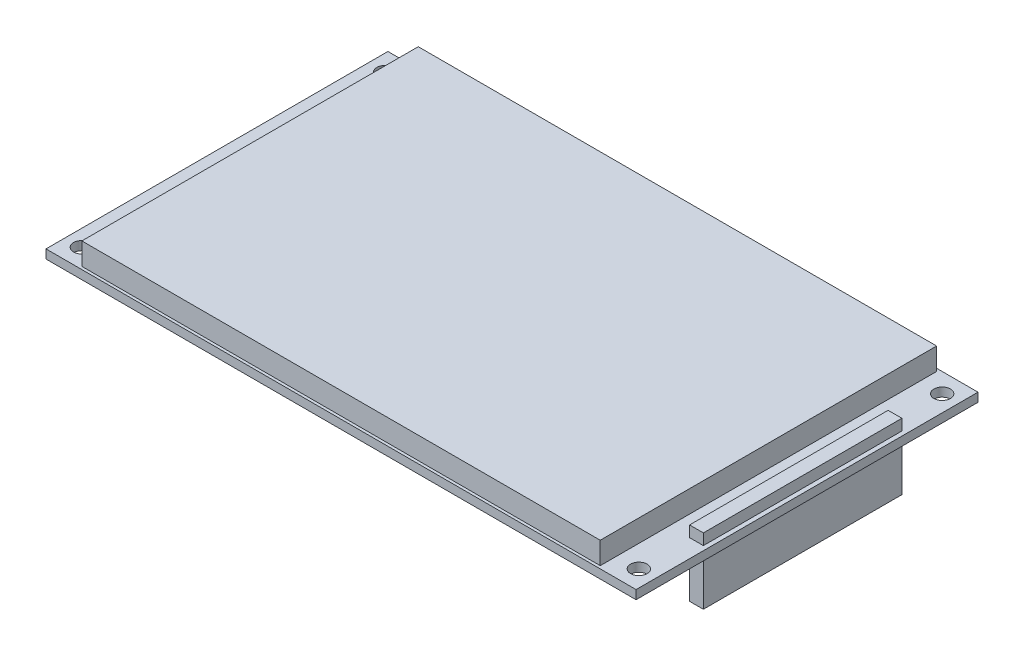
ISO-10303-21;
HEADER;
FILE_DESCRIPTION(('STEP AP214'),'2;1');
FILE_NAME('part.step','',(''),(''),'','','');
FILE_SCHEMA(('AUTOMOTIVE_DESIGN { 1 0 10303 214 1 1 1 1 }'));
ENDSEC;
DATA;
#1=APPLICATION_CONTEXT('core data for automotive mechanical design processes');
#2=APPLICATION_PROTOCOL_DEFINITION('international standard','automotive_design',2000,#1);
#3=PRODUCT_CONTEXT('',#1,'mechanical');
#4=PRODUCT('Part','Part','',(#3));
#5=PRODUCT_RELATED_PRODUCT_CATEGORY('part','',(#4));
#6=PRODUCT_DEFINITION_FORMATION('','',#4);
#7=PRODUCT_DEFINITION_CONTEXT('part definition',#1,'design');
#8=PRODUCT_DEFINITION('design','',#6,#7);
#9=PRODUCT_DEFINITION_SHAPE('','',#8);
#10=(LENGTH_UNIT() NAMED_UNIT(*) SI_UNIT(.MILLI.,.METRE.));
#11=(NAMED_UNIT(*) PLANE_ANGLE_UNIT() SI_UNIT($,.RADIAN.));
#12=(NAMED_UNIT(*) SI_UNIT($,.STERADIAN.) SOLID_ANGLE_UNIT());
#13=UNCERTAINTY_MEASURE_WITH_UNIT(LENGTH_MEASURE(1.E-05),#10,'distance_accuracy_value','');
#14=(GEOMETRIC_REPRESENTATION_CONTEXT(3) GLOBAL_UNCERTAINTY_ASSIGNED_CONTEXT((#13)) GLOBAL_UNIT_ASSIGNED_CONTEXT((#10,
#11,#12)) REPRESENTATION_CONTEXT('',''));
#15=CARTESIAN_POINT('',(0.,0.,0.));
#16=DIRECTION('',(0.,0.,1.));
#17=DIRECTION('',(1.,0.,0.));
#18=AXIS2_PLACEMENT_3D('',#15,#16,#17);
#19=CARTESIAN_POINT('',(-47.,4.,30.5));
#20=DIRECTION('',(1.,0.,0.));
#21=DIRECTION('',(0.,0.,-1.));
#22=AXIS2_PLACEMENT_3D('',#19,#20,#21);
#23=PLANE('',#22);
#24=DIRECTION('',(0.,0.,1.));
#25=VECTOR('',#24,1.);
#26=CARTESIAN_POINT('',(-47.,0.,30.5));
#27=LINE('',#26,#25);
#28=CARTESIAN_POINT('',(-47.,0.,-30.5));
#29=VERTEX_POINT('',#28);
#30=CARTESIAN_POINT('',(-47.,0.,30.5));
#31=VERTEX_POINT('',#30);
#32=EDGE_CURVE('E310',#29,#31,#27,.T.);
#33=ORIENTED_EDGE('',*,*,#32,.T.);
#34=DIRECTION('',(0.,-1.,0.));
#35=VECTOR('',#34,1.);
#36=CARTESIAN_POINT('',(-47.,4.,30.5));
#37=LINE('',#36,#35);
#38=CARTESIAN_POINT('',(-47.,4.,30.5));
#39=VERTEX_POINT('',#38);
#40=EDGE_CURVE('E340',#39,#31,#37,.T.);
#41=ORIENTED_EDGE('',*,*,#40,.F.);
#42=DIRECTION('',(0.,0.,1.));
#43=VECTOR('',#42,1.);
#44=CARTESIAN_POINT('',(-47.,4.,30.5));
#45=LINE('',#44,#43);
#46=CARTESIAN_POINT('',(-47.,4.,-30.5));
#47=VERTEX_POINT('',#46);
#48=EDGE_CURVE('E311',#47,#39,#45,.T.);
#49=ORIENTED_EDGE('',*,*,#48,.F.);
#50=DIRECTION('',(0.,-1.,0.));
#51=VECTOR('',#50,1.);
#52=CARTESIAN_POINT('',(-47.,4.,-30.5));
#53=LINE('',#52,#51);
#54=EDGE_CURVE('E321',#47,#29,#53,.T.);
#55=ORIENTED_EDGE('',*,*,#54,.T.);
#56=EDGE_LOOP('',(#33,#41,#49,#55));
#57=FACE_BOUND('',#56,.T.);
#58=ADVANCED_FACE('F42',(#57),#23,.F.);
#59=CARTESIAN_POINT('',(-47.,4.,30.5));
#60=DIRECTION('',(0.,0.,-1.));
#61=DIRECTION('',(-1.,0.,0.));
#62=AXIS2_PLACEMENT_3D('',#59,#60,#61);
#63=PLANE('',#62);
#64=DIRECTION('',(1.,0.,0.));
#65=VECTOR('',#64,1.);
#66=CARTESIAN_POINT('',(-47.,0.,30.5));
#67=LINE('',#66,#65);
#68=CARTESIAN_POINT('',(47.,0.,30.5));
#69=VERTEX_POINT('',#68);
#70=EDGE_CURVE('E324',#31,#69,#67,.T.);
#71=ORIENTED_EDGE('',*,*,#70,.T.);
#72=DIRECTION('',(0.,-1.,0.));
#73=VECTOR('',#72,1.);
#74=CARTESIAN_POINT('',(47.,4.,30.5));
#75=LINE('',#74,#73);
#76=CARTESIAN_POINT('',(47.,4.,30.5));
#77=VERTEX_POINT('',#76);
#78=EDGE_CURVE('E337',#77,#69,#75,.T.);
#79=ORIENTED_EDGE('',*,*,#78,.F.);
#80=DIRECTION('',(1.,0.,0.));
#81=VECTOR('',#80,1.);
#82=CARTESIAN_POINT('',(-47.,4.,30.5));
#83=LINE('',#82,#81);
#84=EDGE_CURVE('E314',#39,#77,#83,.T.);
#85=ORIENTED_EDGE('',*,*,#84,.F.);
#86=ORIENTED_EDGE('',*,*,#40,.T.);
#87=EDGE_LOOP('',(#71,#79,#85,#86));
#88=FACE_BOUND('',#87,.T.);
#89=ADVANCED_FACE('F380',(#88),#63,.F.);
#90=CARTESIAN_POINT('',(47.,4.,30.5));
#91=DIRECTION('',(-1.,0.,0.));
#92=DIRECTION('',(0.,0.,1.));
#93=AXIS2_PLACEMENT_3D('',#90,#91,#92);
#94=PLANE('',#93);
#95=DIRECTION('',(0.,0.,-1.));
#96=VECTOR('',#95,1.);
#97=CARTESIAN_POINT('',(47.,0.,30.5));
#98=LINE('',#97,#96);
#99=CARTESIAN_POINT('',(47.,0.,-30.5));
#100=VERTEX_POINT('',#99);
#101=EDGE_CURVE('E327',#69,#100,#98,.T.);
#102=ORIENTED_EDGE('',*,*,#101,.T.);
#103=DIRECTION('',(0.,-1.,0.));
#104=VECTOR('',#103,1.);
#105=CARTESIAN_POINT('',(47.,4.,-30.5));
#106=LINE('',#105,#104);
#107=CARTESIAN_POINT('',(47.,4.,-30.5));
#108=VERTEX_POINT('',#107);
#109=EDGE_CURVE('E334',#108,#100,#106,.T.);
#110=ORIENTED_EDGE('',*,*,#109,.F.);
#111=DIRECTION('',(0.,0.,-1.));
#112=VECTOR('',#111,1.);
#113=CARTESIAN_POINT('',(47.,4.,30.5));
#114=LINE('',#113,#112);
#115=EDGE_CURVE('E317',#77,#108,#114,.T.);
#116=ORIENTED_EDGE('',*,*,#115,.F.);
#117=ORIENTED_EDGE('',*,*,#78,.T.);
#118=EDGE_LOOP('',(#102,#110,#116,#117));
#119=FACE_BOUND('',#118,.T.);
#120=ADVANCED_FACE('F385',(#119),#94,.F.);
#121=CARTESIAN_POINT('',(-47.,4.,-30.5));
#122=DIRECTION('',(0.,0.,1.));
#123=DIRECTION('',(1.,0.,0.));
#124=AXIS2_PLACEMENT_3D('',#121,#122,#123);
#125=PLANE('',#124);
#126=DIRECTION('',(-1.,0.,0.));
#127=VECTOR('',#126,1.);
#128=CARTESIAN_POINT('',(-47.,0.,-30.5));
#129=LINE('',#128,#127);
#130=EDGE_CURVE('E315',#100,#29,#129,.T.);
#131=ORIENTED_EDGE('',*,*,#130,.T.);
#132=ORIENTED_EDGE('',*,*,#54,.F.);
#133=DIRECTION('',(-1.,0.,0.));
#134=VECTOR('',#133,1.);
#135=CARTESIAN_POINT('',(-47.,4.,-30.5));
#136=LINE('',#135,#134);
#137=EDGE_CURVE('E319',#108,#47,#136,.T.);
#138=ORIENTED_EDGE('',*,*,#137,.F.);
#139=ORIENTED_EDGE('',*,*,#109,.T.);
#140=EDGE_LOOP('',(#131,#132,#138,#139));
#141=FACE_BOUND('',#140,.T.);
#142=ADVANCED_FACE('F393',(#141),#125,.F.);
#143=CARTESIAN_POINT('',(0.,4.,0.));
#144=DIRECTION('',(0.,-1.,0.));
#145=DIRECTION('',(0.,0.,-1.));
#146=AXIS2_PLACEMENT_3D('',#143,#144,#145);
#147=PLANE('',#146);
#148=ORIENTED_EDGE('',*,*,#48,.T.);
#149=ORIENTED_EDGE('',*,*,#84,.T.);
#150=ORIENTED_EDGE('',*,*,#115,.T.);
#151=ORIENTED_EDGE('',*,*,#137,.T.);
#152=EDGE_LOOP('',(#148,#149,#150,#151));
#153=FACE_BOUND('',#152,.T.);
#154=ADVANCED_FACE('F400',(#153),#147,.F.);
#155=CARTESIAN_POINT('',(0.,0.,0.));
#156=DIRECTION('',(0.,1.,0.));
#157=DIRECTION('',(0.,0.,1.));
#158=AXIS2_PLACEMENT_3D('',#155,#156,#157);
#159=PLANE('',#158);
#160=CARTESIAN_POINT('',(-50.,0.,27.5));
#161=DIRECTION('',(0.,1.,0.));
#162=DIRECTION('',(0.,0.,1.));
#163=AXIS2_PLACEMENT_3D('',#160,#161,#162);
#164=CIRCLE('',#163,1.5);
#165=CARTESIAN_POINT('',(-50.,0.,29.));
#166=VERTEX_POINT('',#165);
#167=EDGE_CURVE('E223',#166,#166,#164,.T.);
#168=ORIENTED_EDGE('',*,*,#167,.F.);
#169=EDGE_LOOP('',(#168));
#170=FACE_BOUND('',#169,.T.);
#171=CARTESIAN_POINT('',(51.,0.,-27.5));
#172=DIRECTION('',(0.,1.,0.));
#173=DIRECTION('',(0.,0.,1.));
#174=AXIS2_PLACEMENT_3D('',#171,#172,#173);
#175=CIRCLE('',#174,1.5);
#176=CARTESIAN_POINT('',(51.,0.,-26.));
#177=VERTEX_POINT('',#176);
#178=EDGE_CURVE('E222',#177,#177,#175,.T.);
#179=ORIENTED_EDGE('',*,*,#178,.F.);
#180=EDGE_LOOP('',(#179));
#181=FACE_BOUND('',#180,.T.);
#182=CARTESIAN_POINT('',(51.,0.,27.5));
#183=DIRECTION('',(0.,1.,0.));
#184=DIRECTION('',(0.,0.,1.));
#185=AXIS2_PLACEMENT_3D('',#182,#183,#184);
#186=CIRCLE('',#185,1.5);
#187=CARTESIAN_POINT('',(51.,0.,29.));
#188=VERTEX_POINT('',#187);
#189=EDGE_CURVE('E216',#188,#188,#186,.T.);
#190=ORIENTED_EDGE('',*,*,#189,.F.);
#191=EDGE_LOOP('',(#190));
#192=FACE_BOUND('',#191,.T.);
#193=CARTESIAN_POINT('',(-50.,0.,-27.5));
#194=DIRECTION('',(0.,1.,0.));
#195=DIRECTION('',(0.,0.,1.));
#196=AXIS2_PLACEMENT_3D('',#193,#194,#195);
#197=CIRCLE('',#196,1.5);
#198=CARTESIAN_POINT('',(-50.,0.,-26.));
#199=VERTEX_POINT('',#198);
#200=EDGE_CURVE('E226',#199,#199,#197,.T.);
#201=ORIENTED_EDGE('',*,*,#200,.F.);
#202=EDGE_LOOP('',(#201));
#203=FACE_BOUND('',#202,.T.);
#204=DIRECTION('',(0.,0.,-1.));
#205=VECTOR('',#204,1.);
#206=CARTESIAN_POINT('',(53.2,0.,0.));
#207=LINE('',#206,#205);
#208=CARTESIAN_POINT('',(53.2,0.,18.));
#209=VERTEX_POINT('',#208);
#210=CARTESIAN_POINT('',(53.2,0.,-18.));
#211=VERTEX_POINT('',#210);
#212=EDGE_CURVE('E66',#209,#211,#207,.T.);
#213=ORIENTED_EDGE('',*,*,#212,.F.);
#214=DIRECTION('',(1.,0.,0.));
#215=VECTOR('',#214,1.);
#216=CARTESIAN_POINT('',(0.,0.,18.));
#217=LINE('',#216,#215);
#218=CARTESIAN_POINT('',(50.7,0.,18.));
#219=VERTEX_POINT('',#218);
#220=EDGE_CURVE('E277',#219,#209,#217,.T.);
#221=ORIENTED_EDGE('',*,*,#220,.F.);
#222=DIRECTION('',(0.,0.,1.));
#223=VECTOR('',#222,1.);
#224=CARTESIAN_POINT('',(50.7,0.,0.));
#225=LINE('',#224,#223);
#226=CARTESIAN_POINT('',(50.7,0.,-18.));
#227=VERTEX_POINT('',#226);
#228=EDGE_CURVE('E274',#227,#219,#225,.T.);
#229=ORIENTED_EDGE('',*,*,#228,.F.);
#230=DIRECTION('',(-1.,0.,0.));
#231=VECTOR('',#230,1.);
#232=CARTESIAN_POINT('',(0.,0.,-18.));
#233=LINE('',#232,#231);
#234=EDGE_CURVE('E260',#211,#227,#233,.T.);
#235=ORIENTED_EDGE('',*,*,#234,.F.);
#236=EDGE_LOOP('',(#213,#221,#229,#235));
#237=FACE_BOUND('',#236,.T.);
#238=DIRECTION('',(0.,0.,-1.));
#239=VECTOR('',#238,1.);
#240=CARTESIAN_POINT('',(-53.,0.,-31.));
#241=LINE('',#240,#239);
#242=CARTESIAN_POINT('',(-53.,0.,31.));
#243=VERTEX_POINT('',#242);
#244=CARTESIAN_POINT('',(-53.,0.,-31.));
#245=VERTEX_POINT('',#244);
#246=EDGE_CURVE('E280',#243,#245,#241,.T.);
#247=ORIENTED_EDGE('',*,*,#246,.F.);
#248=DIRECTION('',(-1.,0.,0.));
#249=VECTOR('',#248,1.);
#250=CARTESIAN_POINT('',(-53.,0.,31.));
#251=LINE('',#250,#249);
#252=CARTESIAN_POINT('',(54.,0.,31.));
#253=VERTEX_POINT('',#252);
#254=EDGE_CURVE('E285',#253,#243,#251,.T.);
#255=ORIENTED_EDGE('',*,*,#254,.F.);
#256=DIRECTION('',(0.,0.,1.));
#257=VECTOR('',#256,1.);
#258=CARTESIAN_POINT('',(54.,0.,-31.));
#259=LINE('',#258,#257);
#260=CARTESIAN_POINT('',(54.,0.,-31.));
#261=VERTEX_POINT('',#260);
#262=EDGE_CURVE('E296',#261,#253,#259,.T.);
#263=ORIENTED_EDGE('',*,*,#262,.F.);
#264=DIRECTION('',(1.,0.,0.));
#265=VECTOR('',#264,1.);
#266=CARTESIAN_POINT('',(-53.,0.,-31.));
#267=LINE('',#266,#265);
#268=EDGE_CURVE('E294',#245,#261,#267,.T.);
#269=ORIENTED_EDGE('',*,*,#268,.F.);
#270=EDGE_LOOP('',(#247,#255,#263,#269));
#271=FACE_BOUND('',#270,.T.);
#272=ORIENTED_EDGE('',*,*,#32,.F.);
#273=ORIENTED_EDGE('',*,*,#130,.F.);
#274=ORIENTED_EDGE('',*,*,#101,.F.);
#275=ORIENTED_EDGE('',*,*,#70,.F.);
#276=EDGE_LOOP('',(#272,#273,#274,#275));
#277=FACE_BOUND('',#276,.T.);
#278=ADVANCED_FACE('F391',(#170,#181,#192,#203,#237,#271,#277),#159,.T.);
#279=CARTESIAN_POINT('',(-53.,-1.6,-31.));
#280=DIRECTION('',(1.,0.,0.));
#281=DIRECTION('',(0.,0.,-1.));
#282=AXIS2_PLACEMENT_3D('',#279,#280,#281);
#283=PLANE('',#282);
#284=ORIENTED_EDGE('',*,*,#246,.T.);
#285=DIRECTION('',(0.,1.,0.));
#286=VECTOR('',#285,1.);
#287=CARTESIAN_POINT('',(-53.,-1.6,-31.));
#288=LINE('',#287,#286);
#289=CARTESIAN_POINT('',(-53.,-1.6,-31.));
#290=VERTEX_POINT('',#289);
#291=EDGE_CURVE('E307',#290,#245,#288,.T.);
#292=ORIENTED_EDGE('',*,*,#291,.F.);
#293=DIRECTION('',(0.,0.,-1.));
#294=VECTOR('',#293,1.);
#295=CARTESIAN_POINT('',(-53.,-1.6,-31.));
#296=LINE('',#295,#294);
#297=CARTESIAN_POINT('',(-53.,-1.6,31.));
#298=VERTEX_POINT('',#297);
#299=EDGE_CURVE('E281',#298,#290,#296,.T.);
#300=ORIENTED_EDGE('',*,*,#299,.F.);
#301=DIRECTION('',(0.,1.,0.));
#302=VECTOR('',#301,1.);
#303=CARTESIAN_POINT('',(-53.,-1.6,31.));
#304=LINE('',#303,#302);
#305=EDGE_CURVE('E291',#298,#243,#304,.T.);
#306=ORIENTED_EDGE('',*,*,#305,.T.);
#307=EDGE_LOOP('',(#284,#292,#300,#306));
#308=FACE_BOUND('',#307,.T.);
#309=ADVANCED_FACE('F407',(#308),#283,.F.);
#310=CARTESIAN_POINT('',(-53.,-1.6,-31.));
#311=DIRECTION('',(0.,0.,1.));
#312=DIRECTION('',(1.,0.,0.));
#313=AXIS2_PLACEMENT_3D('',#310,#311,#312);
#314=PLANE('',#313);
#315=ORIENTED_EDGE('',*,*,#268,.T.);
#316=DIRECTION('',(0.,1.,0.));
#317=VECTOR('',#316,1.);
#318=CARTESIAN_POINT('',(54.,-1.6,-31.));
#319=LINE('',#318,#317);
#320=CARTESIAN_POINT('',(54.,-1.6,-31.));
#321=VERTEX_POINT('',#320);
#322=EDGE_CURVE('E304',#321,#261,#319,.T.);
#323=ORIENTED_EDGE('',*,*,#322,.F.);
#324=DIRECTION('',(1.,0.,0.));
#325=VECTOR('',#324,1.);
#326=CARTESIAN_POINT('',(-53.,-1.6,-31.));
#327=LINE('',#326,#325);
#328=EDGE_CURVE('E284',#290,#321,#327,.T.);
#329=ORIENTED_EDGE('',*,*,#328,.F.);
#330=ORIENTED_EDGE('',*,*,#291,.T.);
#331=EDGE_LOOP('',(#315,#323,#329,#330));
#332=FACE_BOUND('',#331,.T.);
#333=ADVANCED_FACE('F434',(#332),#314,.F.);
#334=CARTESIAN_POINT('',(54.,-1.6,-31.));
#335=DIRECTION('',(-1.,0.,0.));
#336=DIRECTION('',(0.,0.,1.));
#337=AXIS2_PLACEMENT_3D('',#334,#335,#336);
#338=PLANE('',#337);
#339=ORIENTED_EDGE('',*,*,#262,.T.);
#340=DIRECTION('',(0.,1.,0.));
#341=VECTOR('',#340,1.);
#342=CARTESIAN_POINT('',(54.,-1.6,31.));
#343=LINE('',#342,#341);
#344=CARTESIAN_POINT('',(54.,-1.6,31.));
#345=VERTEX_POINT('',#344);
#346=EDGE_CURVE('E301',#345,#253,#343,.T.);
#347=ORIENTED_EDGE('',*,*,#346,.F.);
#348=DIRECTION('',(0.,0.,1.));
#349=VECTOR('',#348,1.);
#350=CARTESIAN_POINT('',(54.,-1.6,-31.));
#351=LINE('',#350,#349);
#352=EDGE_CURVE('E287',#321,#345,#351,.T.);
#353=ORIENTED_EDGE('',*,*,#352,.F.);
#354=ORIENTED_EDGE('',*,*,#322,.T.);
#355=EDGE_LOOP('',(#339,#347,#353,#354));
#356=FACE_BOUND('',#355,.T.);
#357=ADVANCED_FACE('F445',(#356),#338,.F.);
#358=CARTESIAN_POINT('',(-53.,-1.6,31.));
#359=DIRECTION('',(0.,0.,-1.));
#360=DIRECTION('',(-1.,0.,0.));
#361=AXIS2_PLACEMENT_3D('',#358,#359,#360);
#362=PLANE('',#361);
#363=ORIENTED_EDGE('',*,*,#254,.T.);
#364=ORIENTED_EDGE('',*,*,#305,.F.);
#365=DIRECTION('',(-1.,0.,0.));
#366=VECTOR('',#365,1.);
#367=CARTESIAN_POINT('',(-53.,-1.6,31.));
#368=LINE('',#367,#366);
#369=EDGE_CURVE('E289',#345,#298,#368,.T.);
#370=ORIENTED_EDGE('',*,*,#369,.F.);
#371=ORIENTED_EDGE('',*,*,#346,.T.);
#372=EDGE_LOOP('',(#363,#364,#370,#371));
#373=FACE_BOUND('',#372,.T.);
#374=ADVANCED_FACE('F455',(#373),#362,.F.);
#375=CARTESIAN_POINT('',(0.,-1.6,0.));
#376=DIRECTION('',(0.,1.,0.));
#377=DIRECTION('',(0.,0.,1.));
#378=AXIS2_PLACEMENT_3D('',#375,#376,#377);
#379=PLANE('',#378);
#380=DIRECTION('',(1.,0.,0.));
#381=VECTOR('',#380,1.);
#382=CARTESIAN_POINT('',(-25.,-1.6,9.5));
#383=LINE('',#382,#381);
#384=CARTESIAN_POINT('',(-25.,-1.6,9.5));
#385=VERTEX_POINT('',#384);
#386=CARTESIAN_POINT('',(2.,-1.6,9.5));
#387=VERTEX_POINT('',#386);
#388=EDGE_CURVE('E205',#385,#387,#383,.T.);
#389=ORIENTED_EDGE('',*,*,#388,.F.);
#390=DIRECTION('',(0.,0.,1.));
#391=VECTOR('',#390,1.);
#392=CARTESIAN_POINT('',(-25.,-1.6,9.5));
#393=LINE('',#392,#391);
#394=CARTESIAN_POINT('',(-25.,-1.6,26.5));
#395=VERTEX_POINT('',#394);
#396=EDGE_CURVE('E211',#385,#395,#393,.T.);
#397=ORIENTED_EDGE('',*,*,#396,.T.);
#398=DIRECTION('',(1.,0.,0.));
#399=VECTOR('',#398,1.);
#400=CARTESIAN_POINT('',(-25.,-1.6,26.5));
#401=LINE('',#400,#399);
#402=CARTESIAN_POINT('',(2.,-1.6,26.5));
#403=VERTEX_POINT('',#402);
#404=EDGE_CURVE('E187',#395,#403,#401,.T.);
#405=ORIENTED_EDGE('',*,*,#404,.T.);
#406=DIRECTION('',(0.,0.,1.));
#407=VECTOR('',#406,1.);
#408=CARTESIAN_POINT('',(2.,-1.6,9.5));
#409=LINE('',#408,#407);
#410=EDGE_CURVE('E58',#387,#403,#409,.T.);
#411=ORIENTED_EDGE('',*,*,#410,.F.);
#412=EDGE_LOOP('',(#389,#397,#405,#411));
#413=FACE_BOUND('',#412,.T.);
#414=CARTESIAN_POINT('',(-50.,-1.6,27.5));
#415=DIRECTION('',(0.,1.,0.));
#416=DIRECTION('',(0.,0.,1.));
#417=AXIS2_PLACEMENT_3D('',#414,#415,#416);
#418=CIRCLE('',#417,1.5);
#419=CARTESIAN_POINT('',(-50.,-1.6,29.));
#420=VERTEX_POINT('',#419);
#421=EDGE_CURVE('E45',#420,#420,#418,.T.);
#422=ORIENTED_EDGE('',*,*,#421,.T.);
#423=EDGE_LOOP('',(#422));
#424=FACE_BOUND('',#423,.T.);
#425=CARTESIAN_POINT('',(51.,-1.6,-27.5));
#426=DIRECTION('',(0.,1.,0.));
#427=DIRECTION('',(0.,0.,1.));
#428=AXIS2_PLACEMENT_3D('',#425,#426,#427);
#429=CIRCLE('',#428,1.5);
#430=CARTESIAN_POINT('',(51.,-1.6,-26.));
#431=VERTEX_POINT('',#430);
#432=EDGE_CURVE('E355',#431,#431,#429,.T.);
#433=ORIENTED_EDGE('',*,*,#432,.T.);
#434=EDGE_LOOP('',(#433));
#435=FACE_BOUND('',#434,.T.);
#436=CARTESIAN_POINT('',(51.,-1.6,27.5));
#437=DIRECTION('',(0.,1.,0.));
#438=DIRECTION('',(0.,0.,1.));
#439=AXIS2_PLACEMENT_3D('',#436,#437,#438);
#440=CIRCLE('',#439,1.5);
#441=CARTESIAN_POINT('',(51.,-1.6,29.));
#442=VERTEX_POINT('',#441);
#443=EDGE_CURVE('E353',#442,#442,#440,.T.);
#444=ORIENTED_EDGE('',*,*,#443,.T.);
#445=EDGE_LOOP('',(#444));
#446=FACE_BOUND('',#445,.T.);
#447=CARTESIAN_POINT('',(-50.,-1.6,-27.5));
#448=DIRECTION('',(0.,1.,0.));
#449=DIRECTION('',(0.,0.,1.));
#450=AXIS2_PLACEMENT_3D('',#447,#448,#449);
#451=CIRCLE('',#450,1.5);
#452=CARTESIAN_POINT('',(-50.,-1.6,-26.));
#453=VERTEX_POINT('',#452);
#454=EDGE_CURVE('E231',#453,#453,#451,.T.);
#455=ORIENTED_EDGE('',*,*,#454,.T.);
#456=EDGE_LOOP('',(#455));
#457=FACE_BOUND('',#456,.T.);
#458=DIRECTION('',(1.,0.,0.));
#459=VECTOR('',#458,1.);
#460=CARTESIAN_POINT('',(0.,-1.6,18.));
#461=LINE('',#460,#459);
#462=CARTESIAN_POINT('',(50.7,-1.6,18.));
#463=VERTEX_POINT('',#462);
#464=CARTESIAN_POINT('',(53.2,-1.6,18.));
#465=VERTEX_POINT('',#464);
#466=EDGE_CURVE('E50',#463,#465,#461,.T.);
#467=ORIENTED_EDGE('',*,*,#466,.T.);
#468=DIRECTION('',(0.,0.,-1.));
#469=VECTOR('',#468,1.);
#470=CARTESIAN_POINT('',(53.2,-1.6,0.));
#471=LINE('',#470,#469);
#472=CARTESIAN_POINT('',(53.2,-1.6,-18.));
#473=VERTEX_POINT('',#472);
#474=EDGE_CURVE('E11',#465,#473,#471,.T.);
#475=ORIENTED_EDGE('',*,*,#474,.T.);
#476=DIRECTION('',(-1.,0.,0.));
#477=VECTOR('',#476,1.);
#478=CARTESIAN_POINT('',(0.,-1.6,-18.));
#479=LINE('',#478,#477);
#480=CARTESIAN_POINT('',(50.7,-1.6,-18.));
#481=VERTEX_POINT('',#480);
#482=EDGE_CURVE('E343',#473,#481,#479,.T.);
#483=ORIENTED_EDGE('',*,*,#482,.T.);
#484=DIRECTION('',(0.,0.,1.));
#485=VECTOR('',#484,1.);
#486=CARTESIAN_POINT('',(50.7,-1.6,0.));
#487=LINE('',#486,#485);
#488=EDGE_CURVE('E346',#481,#463,#487,.T.);
#489=ORIENTED_EDGE('',*,*,#488,.T.);
#490=EDGE_LOOP('',(#467,#475,#483,#489));
#491=FACE_BOUND('',#490,.T.);
#492=ORIENTED_EDGE('',*,*,#299,.T.);
#493=ORIENTED_EDGE('',*,*,#328,.T.);
#494=ORIENTED_EDGE('',*,*,#352,.T.);
#495=ORIENTED_EDGE('',*,*,#369,.T.);
#496=EDGE_LOOP('',(#492,#493,#494,#495));
#497=FACE_BOUND('',#496,.T.);
#498=ADVANCED_FACE('F362',(#413,#424,#435,#446,#457,#491,#497),#379,.F.);
#499=CARTESIAN_POINT('',(0.,-10.,0.));
#500=DIRECTION('',(0.,-1.,0.));
#501=DIRECTION('',(0.,0.,-1.));
#502=AXIS2_PLACEMENT_3D('',#499,#500,#501);
#503=PLANE('',#502);
#504=DIRECTION('',(0.,0.,-1.));
#505=VECTOR('',#504,1.);
#506=CARTESIAN_POINT('',(53.2,-10.,-18.));
#507=LINE('',#506,#505);
#508=CARTESIAN_POINT('',(53.2,-10.,18.));
#509=VERTEX_POINT('',#508);
#510=CARTESIAN_POINT('',(53.2,-10.,-18.));
#511=VERTEX_POINT('',#510);
#512=EDGE_CURVE('E244',#509,#511,#507,.T.);
#513=ORIENTED_EDGE('',*,*,#512,.F.);
#514=DIRECTION('',(1.,0.,0.));
#515=VECTOR('',#514,1.);
#516=CARTESIAN_POINT('',(53.2,-10.,18.));
#517=LINE('',#516,#515);
#518=CARTESIAN_POINT('',(50.7,-10.,18.));
#519=VERTEX_POINT('',#518);
#520=EDGE_CURVE('E253',#519,#509,#517,.T.);
#521=ORIENTED_EDGE('',*,*,#520,.F.);
#522=DIRECTION('',(0.,0.,1.));
#523=VECTOR('',#522,1.);
#524=CARTESIAN_POINT('',(50.7,-10.,-18.));
#525=LINE('',#524,#523);
#526=CARTESIAN_POINT('',(50.7,-10.,-18.));
#527=VERTEX_POINT('',#526);
#528=EDGE_CURVE('E250',#527,#519,#525,.T.);
#529=ORIENTED_EDGE('',*,*,#528,.F.);
#530=DIRECTION('',(-1.,0.,0.));
#531=VECTOR('',#530,1.);
#532=CARTESIAN_POINT('',(53.2,-10.,-18.));
#533=LINE('',#532,#531);
#534=EDGE_CURVE('E247',#511,#527,#533,.T.);
#535=ORIENTED_EDGE('',*,*,#534,.F.);
#536=EDGE_LOOP('',(#513,#521,#529,#535));
#537=FACE_BOUND('',#536,.T.);
#538=ADVANCED_FACE('F474',(#537),#503,.T.);
#539=CARTESIAN_POINT('',(53.2,-10.,-18.));
#540=DIRECTION('',(0.,0.,-1.));
#541=DIRECTION('',(-1.,0.,0.));
#542=AXIS2_PLACEMENT_3D('',#539,#540,#541);
#543=PLANE('',#542);
#544=ORIENTED_EDGE('',*,*,#482,.F.);
#545=DIRECTION('',(0.,1.,0.));
#546=VECTOR('',#545,1.);
#547=CARTESIAN_POINT('',(53.2,-10.,-18.));
#548=LINE('',#547,#546);
#549=EDGE_CURVE('E269',#511,#473,#548,.T.);
#550=ORIENTED_EDGE('',*,*,#549,.F.);
#551=ORIENTED_EDGE('',*,*,#534,.T.);
#552=DIRECTION('',(0.,1.,0.));
#553=VECTOR('',#552,1.);
#554=CARTESIAN_POINT('',(50.7,-10.,-18.));
#555=LINE('',#554,#553);
#556=EDGE_CURVE('E266',#527,#481,#555,.T.);
#557=ORIENTED_EDGE('',*,*,#556,.T.);
#558=EDGE_LOOP('',(#544,#550,#551,#557));
#559=FACE_BOUND('',#558,.T.);
#560=ADVANCED_FACE('F479',(#559),#543,.T.);
#561=CARTESIAN_POINT('',(50.7,-10.,-18.));
#562=DIRECTION('',(-1.,0.,0.));
#563=DIRECTION('',(0.,0.,1.));
#564=AXIS2_PLACEMENT_3D('',#561,#562,#563);
#565=PLANE('',#564);
#566=ORIENTED_EDGE('',*,*,#488,.F.);
#567=ORIENTED_EDGE('',*,*,#556,.F.);
#568=ORIENTED_EDGE('',*,*,#528,.T.);
#569=DIRECTION('',(0.,1.,0.));
#570=VECTOR('',#569,1.);
#571=CARTESIAN_POINT('',(50.7,-10.,18.));
#572=LINE('',#571,#570);
#573=EDGE_CURVE('E262',#519,#463,#572,.T.);
#574=ORIENTED_EDGE('',*,*,#573,.T.);
#575=EDGE_LOOP('',(#566,#567,#568,#574));
#576=FACE_BOUND('',#575,.T.);
#577=ADVANCED_FACE('F490',(#576),#565,.T.);
#578=CARTESIAN_POINT('',(53.2,-10.,18.));
#579=DIRECTION('',(0.,0.,1.));
#580=DIRECTION('',(1.,0.,0.));
#581=AXIS2_PLACEMENT_3D('',#578,#579,#580);
#582=PLANE('',#581);
#583=ORIENTED_EDGE('',*,*,#466,.F.);
#584=ORIENTED_EDGE('',*,*,#573,.F.);
#585=ORIENTED_EDGE('',*,*,#520,.T.);
#586=DIRECTION('',(0.,1.,0.));
#587=VECTOR('',#586,1.);
#588=CARTESIAN_POINT('',(53.2,-10.,18.));
#589=LINE('',#588,#587);
#590=EDGE_CURVE('E257',#509,#465,#589,.T.);
#591=ORIENTED_EDGE('',*,*,#590,.T.);
#592=EDGE_LOOP('',(#583,#584,#585,#591));
#593=FACE_BOUND('',#592,.T.);
#594=ADVANCED_FACE('F502',(#593),#582,.T.);
#595=CARTESIAN_POINT('',(53.2,-10.,-18.));
#596=DIRECTION('',(1.,0.,0.));
#597=DIRECTION('',(0.,0.,-1.));
#598=AXIS2_PLACEMENT_3D('',#595,#596,#597);
#599=PLANE('',#598);
#600=ORIENTED_EDGE('',*,*,#474,.F.);
#601=ORIENTED_EDGE('',*,*,#590,.F.);
#602=ORIENTED_EDGE('',*,*,#512,.T.);
#603=ORIENTED_EDGE('',*,*,#549,.T.);
#604=EDGE_LOOP('',(#600,#601,#602,#603));
#605=FACE_BOUND('',#604,.T.);
#606=ADVANCED_FACE('F514',(#605),#599,.T.);
#607=CARTESIAN_POINT('',(53.2,2.,18.));
#608=VERTEX_POINT('',#607);
#609=EDGE_CURVE('E261',#209,#608,#589,.T.);
#610=ORIENTED_EDGE('',*,*,#609,.F.);
#611=ORIENTED_EDGE('',*,*,#212,.T.);
#612=CARTESIAN_POINT('',(53.2,2.,-18.));
#613=VERTEX_POINT('',#612);
#614=EDGE_CURVE('E256',#211,#613,#548,.T.);
#615=ORIENTED_EDGE('',*,*,#614,.T.);
#616=DIRECTION('',(0.,0.,-1.));
#617=VECTOR('',#616,1.);
#618=CARTESIAN_POINT('',(53.2,2.,-18.));
#619=LINE('',#618,#617);
#620=EDGE_CURVE('E232',#608,#613,#619,.T.);
#621=ORIENTED_EDGE('',*,*,#620,.F.);
#622=EDGE_LOOP('',(#610,#611,#615,#621));
#623=FACE_BOUND('',#622,.T.);
#624=ADVANCED_FACE('F526',(#623),#599,.T.);
#625=CARTESIAN_POINT('',(50.7,2.,18.));
#626=VERTEX_POINT('',#625);
#627=EDGE_CURVE('E265',#219,#626,#572,.T.);
#628=ORIENTED_EDGE('',*,*,#627,.F.);
#629=ORIENTED_EDGE('',*,*,#220,.T.);
#630=ORIENTED_EDGE('',*,*,#609,.T.);
#631=DIRECTION('',(1.,0.,0.));
#632=VECTOR('',#631,1.);
#633=CARTESIAN_POINT('',(53.2,2.,18.));
#634=LINE('',#633,#632);
#635=EDGE_CURVE('E241',#626,#608,#634,.T.);
#636=ORIENTED_EDGE('',*,*,#635,.F.);
#637=EDGE_LOOP('',(#628,#629,#630,#636));
#638=FACE_BOUND('',#637,.T.);
#639=ADVANCED_FACE('F517',(#638),#582,.T.);
#640=CARTESIAN_POINT('',(50.7,2.,-18.));
#641=VERTEX_POINT('',#640);
#642=EDGE_CURVE('E268',#227,#641,#555,.T.);
#643=ORIENTED_EDGE('',*,*,#642,.F.);
#644=ORIENTED_EDGE('',*,*,#228,.T.);
#645=ORIENTED_EDGE('',*,*,#627,.T.);
#646=DIRECTION('',(0.,0.,1.));
#647=VECTOR('',#646,1.);
#648=CARTESIAN_POINT('',(50.7,2.,-18.));
#649=LINE('',#648,#647);
#650=EDGE_CURVE('E238',#641,#626,#649,.T.);
#651=ORIENTED_EDGE('',*,*,#650,.F.);
#652=EDGE_LOOP('',(#643,#644,#645,#651));
#653=FACE_BOUND('',#652,.T.);
#654=ADVANCED_FACE('F505',(#653),#565,.T.);
#655=ORIENTED_EDGE('',*,*,#614,.F.);
#656=ORIENTED_EDGE('',*,*,#234,.T.);
#657=ORIENTED_EDGE('',*,*,#642,.T.);
#658=DIRECTION('',(-1.,0.,0.));
#659=VECTOR('',#658,1.);
#660=CARTESIAN_POINT('',(53.2,2.,-18.));
#661=LINE('',#660,#659);
#662=EDGE_CURVE('E235',#613,#641,#661,.T.);
#663=ORIENTED_EDGE('',*,*,#662,.F.);
#664=EDGE_LOOP('',(#655,#656,#657,#663));
#665=FACE_BOUND('',#664,.T.);
#666=ADVANCED_FACE('F493',(#665),#543,.T.);
#667=CARTESIAN_POINT('',(0.,2.,0.));
#668=DIRECTION('',(0.,-1.,0.));
#669=DIRECTION('',(0.,0.,-1.));
#670=AXIS2_PLACEMENT_3D('',#667,#668,#669);
#671=PLANE('',#670);
#672=ORIENTED_EDGE('',*,*,#620,.T.);
#673=ORIENTED_EDGE('',*,*,#662,.T.);
#674=ORIENTED_EDGE('',*,*,#650,.T.);
#675=ORIENTED_EDGE('',*,*,#635,.T.);
#676=EDGE_LOOP('',(#672,#673,#674,#675));
#677=FACE_BOUND('',#676,.T.);
#678=ADVANCED_FACE('F564',(#677),#671,.F.);
#679=CARTESIAN_POINT('',(-50.,-2.,-27.5));
#680=DIRECTION('',(0.,1.,0.));
#681=DIRECTION('',(0.,0.,1.));
#682=AXIS2_PLACEMENT_3D('',#679,#680,#681);
#683=CYLINDRICAL_SURFACE('',#682,1.5);
#684=ORIENTED_EDGE('',*,*,#200,.T.);
#685=EDGE_LOOP('',(#684));
#686=FACE_BOUND('',#685,.T.);
#687=ORIENTED_EDGE('',*,*,#454,.F.);
#688=EDGE_LOOP('',(#687));
#689=FACE_BOUND('',#688,.T.);
#690=ADVANCED_FACE('F574',(#686,#689),#683,.F.);
#691=CARTESIAN_POINT('',(51.,-2.,27.5));
#692=DIRECTION('',(0.,1.,0.));
#693=DIRECTION('',(0.,0.,1.));
#694=AXIS2_PLACEMENT_3D('',#691,#692,#693);
#695=CYLINDRICAL_SURFACE('',#694,1.5);
#696=ORIENTED_EDGE('',*,*,#189,.T.);
#697=EDGE_LOOP('',(#696));
#698=FACE_BOUND('',#697,.T.);
#699=ORIENTED_EDGE('',*,*,#443,.F.);
#700=EDGE_LOOP('',(#699));
#701=FACE_BOUND('',#700,.T.);
#702=ADVANCED_FACE('F375',(#698,#701),#695,.F.);
#703=CARTESIAN_POINT('',(51.,-2.,-27.5));
#704=DIRECTION('',(0.,1.,0.));
#705=DIRECTION('',(0.,0.,1.));
#706=AXIS2_PLACEMENT_3D('',#703,#704,#705);
#707=CYLINDRICAL_SURFACE('',#706,1.5);
#708=ORIENTED_EDGE('',*,*,#178,.T.);
#709=EDGE_LOOP('',(#708));
#710=FACE_BOUND('',#709,.T.);
#711=ORIENTED_EDGE('',*,*,#432,.F.);
#712=EDGE_LOOP('',(#711));
#713=FACE_BOUND('',#712,.T.);
#714=ADVANCED_FACE('F366',(#710,#713),#707,.F.);
#715=CARTESIAN_POINT('',(-50.,-2.,27.5));
#716=DIRECTION('',(0.,1.,0.));
#717=DIRECTION('',(0.,0.,1.));
#718=AXIS2_PLACEMENT_3D('',#715,#716,#717);
#719=CYLINDRICAL_SURFACE('',#718,1.5);
#720=ORIENTED_EDGE('',*,*,#167,.T.);
#721=EDGE_LOOP('',(#720));
#722=FACE_BOUND('',#721,.T.);
#723=ORIENTED_EDGE('',*,*,#421,.F.);
#724=EDGE_LOOP('',(#723));
#725=FACE_BOUND('',#724,.T.);
#726=ADVANCED_FACE('F364',(#722,#725),#719,.F.);
#727=CARTESIAN_POINT('',(-25.,-4.6,9.5));
#728=DIRECTION('',(-1.,0.,0.));
#729=DIRECTION('',(0.,0.,1.));
#730=AXIS2_PLACEMENT_3D('',#727,#728,#729);
#731=PLANE('',#730);
#732=ORIENTED_EDGE('',*,*,#396,.F.);
#733=DIRECTION('',(0.,1.,0.));
#734=VECTOR('',#733,1.);
#735=CARTESIAN_POINT('',(-25.,-4.6,9.5));
#736=LINE('',#735,#734);
#737=CARTESIAN_POINT('',(-25.,-4.6,9.5));
#738=VERTEX_POINT('',#737);
#739=EDGE_CURVE('E203',#738,#385,#736,.T.);
#740=ORIENTED_EDGE('',*,*,#739,.F.);
#741=DIRECTION('',(0.,0.,1.));
#742=VECTOR('',#741,1.);
#743=CARTESIAN_POINT('',(-25.,-4.6,9.5));
#744=LINE('',#743,#742);
#745=CARTESIAN_POINT('',(-25.,-4.6,26.5));
#746=VERTEX_POINT('',#745);
#747=EDGE_CURVE('E198',#738,#746,#744,.T.);
#748=ORIENTED_EDGE('',*,*,#747,.T.);
#749=DIRECTION('',(0.,1.,0.));
#750=VECTOR('',#749,1.);
#751=CARTESIAN_POINT('',(-25.,-4.6,26.5));
#752=LINE('',#751,#750);
#753=EDGE_CURVE('E182',#746,#395,#752,.T.);
#754=ORIENTED_EDGE('',*,*,#753,.T.);
#755=EDGE_LOOP('',(#732,#740,#748,#754));
#756=FACE_BOUND('',#755,.T.);
#757=ADVANCED_FACE('F202',(#756),#731,.T.);
#758=CARTESIAN_POINT('',(-25.,-4.6,9.5));
#759=DIRECTION('',(0.,0.,1.));
#760=DIRECTION('',(1.,0.,0.));
#761=AXIS2_PLACEMENT_3D('',#758,#759,#760);
#762=PLANE('',#761);
#763=ORIENTED_EDGE('',*,*,#388,.T.);
#764=DIRECTION('',(0.,1.,0.));
#765=VECTOR('',#764,1.);
#766=CARTESIAN_POINT('',(2.,-4.6,9.5));
#767=LINE('',#766,#765);
#768=CARTESIAN_POINT('',(2.,-4.6,9.5));
#769=VERTEX_POINT('',#768);
#770=EDGE_CURVE('E217',#769,#387,#767,.T.);
#771=ORIENTED_EDGE('',*,*,#770,.F.);
#772=DIRECTION('',(1.,0.,0.));
#773=VECTOR('',#772,1.);
#774=CARTESIAN_POINT('',(-25.,-4.6,9.5));
#775=LINE('',#774,#773);
#776=EDGE_CURVE('E193',#738,#769,#775,.T.);
#777=ORIENTED_EDGE('',*,*,#776,.F.);
#778=ORIENTED_EDGE('',*,*,#739,.T.);
#779=EDGE_LOOP('',(#763,#771,#777,#778));
#780=FACE_BOUND('',#779,.T.);
#781=ADVANCED_FACE('F373',(#780),#762,.F.);
#782=CARTESIAN_POINT('',(2.,-4.6,9.5));
#783=DIRECTION('',(-1.,0.,0.));
#784=DIRECTION('',(0.,0.,1.));
#785=AXIS2_PLACEMENT_3D('',#782,#783,#784);
#786=PLANE('',#785);
#787=ORIENTED_EDGE('',*,*,#410,.T.);
#788=DIRECTION('',(0.,1.,0.));
#789=VECTOR('',#788,1.);
#790=CARTESIAN_POINT('',(2.,-4.6,26.5));
#791=LINE('',#790,#789);
#792=CARTESIAN_POINT('',(2.,-4.6,26.5));
#793=VERTEX_POINT('',#792);
#794=EDGE_CURVE('E192',#793,#403,#791,.T.);
#795=ORIENTED_EDGE('',*,*,#794,.F.);
#796=DIRECTION('',(0.,0.,1.));
#797=VECTOR('',#796,1.);
#798=CARTESIAN_POINT('',(2.,-4.6,9.5));
#799=LINE('',#798,#797);
#800=EDGE_CURVE('E200',#769,#793,#799,.T.);
#801=ORIENTED_EDGE('',*,*,#800,.F.);
#802=ORIENTED_EDGE('',*,*,#770,.T.);
#803=EDGE_LOOP('',(#787,#795,#801,#802));
#804=FACE_BOUND('',#803,.T.);
#805=ADVANCED_FACE('F637',(#804),#786,.F.);
#806=CARTESIAN_POINT('',(-25.,-4.6,26.5));
#807=DIRECTION('',(0.,0.,1.));
#808=DIRECTION('',(1.,0.,0.));
#809=AXIS2_PLACEMENT_3D('',#806,#807,#808);
#810=PLANE('',#809);
#811=ORIENTED_EDGE('',*,*,#404,.F.);
#812=ORIENTED_EDGE('',*,*,#753,.F.);
#813=DIRECTION('',(1.,0.,0.));
#814=VECTOR('',#813,1.);
#815=CARTESIAN_POINT('',(-25.,-4.6,26.5));
#816=LINE('',#815,#814);
#817=EDGE_CURVE('E185',#746,#793,#816,.T.);
#818=ORIENTED_EDGE('',*,*,#817,.T.);
#819=ORIENTED_EDGE('',*,*,#794,.T.);
#820=EDGE_LOOP('',(#811,#812,#818,#819));
#821=FACE_BOUND('',#820,.T.);
#822=ADVANCED_FACE('F184',(#821),#810,.T.);
#823=CARTESIAN_POINT('',(0.,-4.6,0.));
#824=DIRECTION('',(0.,1.,0.));
#825=DIRECTION('',(0.,0.,1.));
#826=AXIS2_PLACEMENT_3D('',#823,#824,#825);
#827=PLANE('',#826);
#828=ORIENTED_EDGE('',*,*,#747,.F.);
#829=ORIENTED_EDGE('',*,*,#776,.T.);
#830=ORIENTED_EDGE('',*,*,#800,.T.);
#831=ORIENTED_EDGE('',*,*,#817,.F.);
#832=EDGE_LOOP('',(#828,#829,#830,#831));
#833=FACE_BOUND('',#832,.T.);
#834=ADVANCED_FACE('F197',(#833),#827,.F.);
#835=CLOSED_SHELL('',(#58,#89,#120,#142,#154,#278,#309,#333,#357,#374,#498,#538,#560,#577,#594,
#606,#624,#639,#654,#666,#678,#690,#702,#714,#726,#757,#781,#805,#822,#834));
#836=MANIFOLD_SOLID_BREP('B2',#835);
#837=ADVANCED_BREP_SHAPE_REPRESENTATION('',(#18,#836),#14);
#838=SHAPE_DEFINITION_REPRESENTATION(#9,#837);
ENDSEC;
END-ISO-10303-21;
